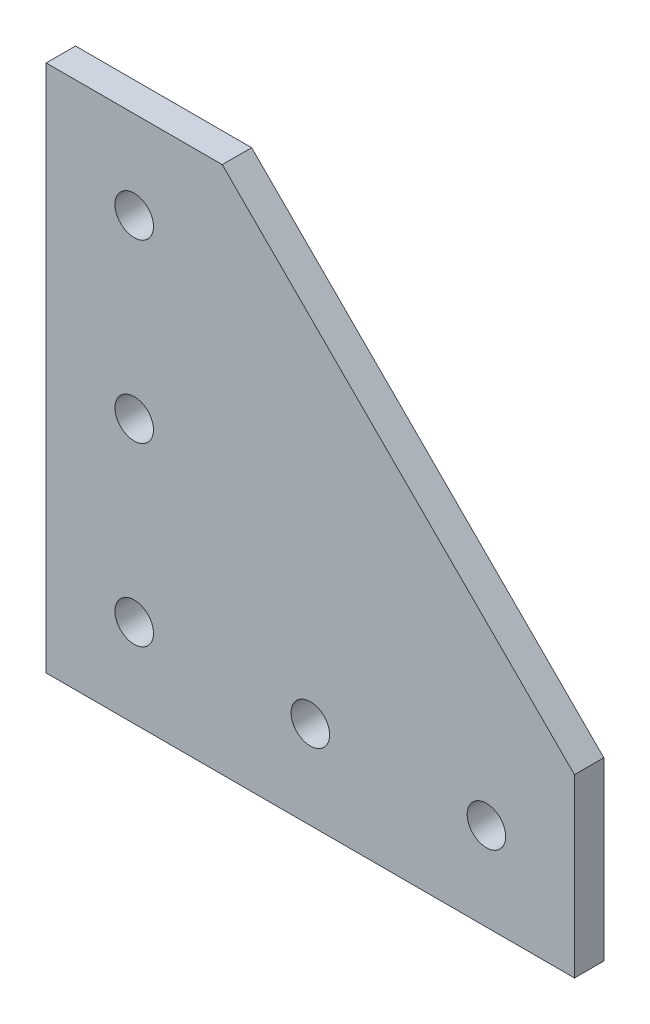
ISO-10303-21;
HEADER;
FILE_DESCRIPTION(('STEP AP214'),'2;1');
FILE_NAME('part.step','',(''),(''),'','','');
FILE_SCHEMA(('AUTOMOTIVE_DESIGN { 1 0 10303 214 1 1 1 1 }'));
ENDSEC;
DATA;
#1=APPLICATION_CONTEXT('core data for automotive mechanical design processes');
#2=APPLICATION_PROTOCOL_DEFINITION('international standard','automotive_design',2000,#1);
#3=PRODUCT_CONTEXT('',#1,'mechanical');
#4=PRODUCT('Part','Part','',(#3));
#5=PRODUCT_RELATED_PRODUCT_CATEGORY('part','',(#4));
#6=PRODUCT_DEFINITION_FORMATION('','',#4);
#7=PRODUCT_DEFINITION_CONTEXT('part definition',#1,'design');
#8=PRODUCT_DEFINITION('design','',#6,#7);
#9=PRODUCT_DEFINITION_SHAPE('','',#8);
#10=(LENGTH_UNIT() NAMED_UNIT(*) SI_UNIT(.MILLI.,.METRE.));
#11=(NAMED_UNIT(*) PLANE_ANGLE_UNIT() SI_UNIT($,.RADIAN.));
#12=(NAMED_UNIT(*) SI_UNIT($,.STERADIAN.) SOLID_ANGLE_UNIT());
#13=UNCERTAINTY_MEASURE_WITH_UNIT(LENGTH_MEASURE(1.E-05),#10,'distance_accuracy_value','');
#14=(GEOMETRIC_REPRESENTATION_CONTEXT(3) GLOBAL_UNCERTAINTY_ASSIGNED_CONTEXT((#13)) GLOBAL_UNIT_ASSIGNED_CONTEXT((#10,
#11,#12)) REPRESENTATION_CONTEXT('',''));
#15=CARTESIAN_POINT('',(0.,0.,0.));
#16=DIRECTION('',(0.,0.,1.));
#17=DIRECTION('',(1.,0.,0.));
#18=AXIS2_PLACEMENT_3D('',#15,#16,#17);
#19=CARTESIAN_POINT('',(0.,0.,3.175));
#20=DIRECTION('',(0.,0.,-1.));
#21=DIRECTION('',(-1.,0.,0.));
#22=AXIS2_PLACEMENT_3D('',#19,#20,#21);
#23=PLANE('',#22);
#24=CARTESIAN_POINT('',(19.05,95.25,3.175));
#25=DIRECTION('',(0.,0.,1.));
#26=DIRECTION('',(1.,0.,0.));
#27=AXIS2_PLACEMENT_3D('',#24,#25,#26);
#28=CIRCLE('',#27,4.1656);
#29=CARTESIAN_POINT('',(23.2156,95.25,3.175));
#30=VERTEX_POINT('',#29);
#31=EDGE_CURVE('E178',#30,#30,#28,.T.);
#32=ORIENTED_EDGE('',*,*,#31,.F.);
#33=EDGE_LOOP('',(#32));
#34=FACE_BOUND('',#33,.T.);
#35=CARTESIAN_POINT('',(57.15,19.05,3.175));
#36=DIRECTION('',(0.,0.,1.));
#37=DIRECTION('',(1.,0.,0.));
#38=AXIS2_PLACEMENT_3D('',#35,#36,#37);
#39=CIRCLE('',#38,4.1656);
#40=CARTESIAN_POINT('',(61.3156,19.05,3.175));
#41=VERTEX_POINT('',#40);
#42=EDGE_CURVE('E190',#41,#41,#39,.T.);
#43=ORIENTED_EDGE('',*,*,#42,.F.);
#44=EDGE_LOOP('',(#43));
#45=FACE_BOUND('',#44,.T.);
#46=DIRECTION('',(1.,0.,0.));
#47=VECTOR('',#46,1.);
#48=CARTESIAN_POINT('',(114.3,0.,3.175));
#49=LINE('',#48,#47);
#50=CARTESIAN_POINT('',(0.,0.,3.175));
#51=VERTEX_POINT('',#50);
#52=CARTESIAN_POINT('',(114.3,0.,3.175));
#53=VERTEX_POINT('',#52);
#54=EDGE_CURVE('E118',#51,#53,#49,.T.);
#55=ORIENTED_EDGE('',*,*,#54,.T.);
#56=DIRECTION('',(0.,1.,0.));
#57=VECTOR('',#56,1.);
#58=CARTESIAN_POINT('',(114.3,38.1,3.175));
#59=LINE('',#58,#57);
#60=CARTESIAN_POINT('',(114.3,38.1,3.175));
#61=VERTEX_POINT('',#60);
#62=EDGE_CURVE('E85',#53,#61,#59,.T.);
#63=ORIENTED_EDGE('',*,*,#62,.T.);
#64=DIRECTION('',(-0.707106781186548,0.707106781186548,0.));
#65=VECTOR('',#64,1.);
#66=CARTESIAN_POINT('',(114.3,38.1,3.175));
#67=LINE('',#66,#65);
#68=CARTESIAN_POINT('',(38.1,114.3,3.175));
#69=VERTEX_POINT('',#68);
#70=EDGE_CURVE('E89',#61,#69,#67,.T.);
#71=ORIENTED_EDGE('',*,*,#70,.T.);
#72=DIRECTION('',(-1.,0.,0.));
#73=VECTOR('',#72,1.);
#74=CARTESIAN_POINT('',(0.,114.3,3.175));
#75=LINE('',#74,#73);
#76=CARTESIAN_POINT('',(0.,114.3,3.175));
#77=VERTEX_POINT('',#76);
#78=EDGE_CURVE('E93',#69,#77,#75,.T.);
#79=ORIENTED_EDGE('',*,*,#78,.T.);
#80=DIRECTION('',(0.,-1.,0.));
#81=VECTOR('',#80,1.);
#82=CARTESIAN_POINT('',(0.,0.,3.175));
#83=LINE('',#82,#81);
#84=EDGE_CURVE('E51',#77,#51,#83,.T.);
#85=ORIENTED_EDGE('',*,*,#84,.T.);
#86=EDGE_LOOP('',(#55,#63,#71,#79,#85));
#87=FACE_BOUND('',#86,.T.);
#88=CARTESIAN_POINT('',(19.05,19.05,3.175));
#89=DIRECTION('',(0.,0.,1.));
#90=DIRECTION('',(1.,0.,0.));
#91=AXIS2_PLACEMENT_3D('',#88,#89,#90);
#92=CIRCLE('',#91,4.1656);
#93=CARTESIAN_POINT('',(23.2156,19.05,3.175));
#94=VERTEX_POINT('',#93);
#95=EDGE_CURVE('E113',#94,#94,#92,.T.);
#96=ORIENTED_EDGE('',*,*,#95,.F.);
#97=EDGE_LOOP('',(#96));
#98=FACE_BOUND('',#97,.T.);
#99=CARTESIAN_POINT('',(95.25,19.05,3.175));
#100=DIRECTION('',(0.,0.,1.));
#101=DIRECTION('',(1.,0.,0.));
#102=AXIS2_PLACEMENT_3D('',#99,#100,#101);
#103=CIRCLE('',#102,4.1656);
#104=CARTESIAN_POINT('',(99.4156,19.05,3.175));
#105=VERTEX_POINT('',#104);
#106=EDGE_CURVE('E184',#105,#105,#103,.T.);
#107=ORIENTED_EDGE('',*,*,#106,.F.);
#108=EDGE_LOOP('',(#107));
#109=FACE_BOUND('',#108,.T.);
#110=CARTESIAN_POINT('',(19.05,57.15,3.175));
#111=DIRECTION('',(0.,0.,1.));
#112=DIRECTION('',(1.,0.,0.));
#113=AXIS2_PLACEMENT_3D('',#110,#111,#112);
#114=CIRCLE('',#113,4.1656);
#115=CARTESIAN_POINT('',(23.2156,57.15,3.175));
#116=VERTEX_POINT('',#115);
#117=EDGE_CURVE('E169',#116,#116,#114,.T.);
#118=ORIENTED_EDGE('',*,*,#117,.F.);
#119=EDGE_LOOP('',(#118));
#120=FACE_BOUND('',#119,.T.);
#121=ADVANCED_FACE('F34',(#34,#45,#87,#98,#109,#120),#23,.F.);
#122=CARTESIAN_POINT('',(0.,0.,-3.175));
#123=DIRECTION('',(0.,0.,-1.));
#124=DIRECTION('',(-1.,0.,0.));
#125=AXIS2_PLACEMENT_3D('',#122,#123,#124);
#126=PLANE('',#125);
#127=CARTESIAN_POINT('',(19.05,95.25,-3.175));
#128=DIRECTION('',(0.,0.,1.));
#129=DIRECTION('',(1.,0.,0.));
#130=AXIS2_PLACEMENT_3D('',#127,#128,#129);
#131=CIRCLE('',#130,4.1656);
#132=CARTESIAN_POINT('',(23.2156,95.25,-3.175));
#133=VERTEX_POINT('',#132);
#134=EDGE_CURVE('E175',#133,#133,#131,.T.);
#135=ORIENTED_EDGE('',*,*,#134,.T.);
#136=EDGE_LOOP('',(#135));
#137=FACE_BOUND('',#136,.T.);
#138=CARTESIAN_POINT('',(57.15,19.05,-3.175));
#139=DIRECTION('',(0.,0.,1.));
#140=DIRECTION('',(1.,0.,0.));
#141=AXIS2_PLACEMENT_3D('',#138,#139,#140);
#142=CIRCLE('',#141,4.1656);
#143=CARTESIAN_POINT('',(61.3156,19.05,-3.175));
#144=VERTEX_POINT('',#143);
#145=EDGE_CURVE('E187',#144,#144,#142,.T.);
#146=ORIENTED_EDGE('',*,*,#145,.T.);
#147=EDGE_LOOP('',(#146));
#148=FACE_BOUND('',#147,.T.);
#149=DIRECTION('',(1.,0.,0.));
#150=VECTOR('',#149,1.);
#151=CARTESIAN_POINT('',(114.3,0.,-3.175));
#152=LINE('',#151,#150);
#153=CARTESIAN_POINT('',(0.,0.,-3.175));
#154=VERTEX_POINT('',#153);
#155=CARTESIAN_POINT('',(114.3,0.,-3.175));
#156=VERTEX_POINT('',#155);
#157=EDGE_CURVE('E109',#154,#156,#152,.T.);
#158=ORIENTED_EDGE('',*,*,#157,.F.);
#159=DIRECTION('',(0.,-1.,0.));
#160=VECTOR('',#159,1.);
#161=CARTESIAN_POINT('',(0.,0.,-3.175));
#162=LINE('',#161,#160);
#163=CARTESIAN_POINT('',(0.,114.3,-3.175));
#164=VERTEX_POINT('',#163);
#165=EDGE_CURVE('E77',#164,#154,#162,.T.);
#166=ORIENTED_EDGE('',*,*,#165,.F.);
#167=DIRECTION('',(-1.,0.,0.));
#168=VECTOR('',#167,1.);
#169=CARTESIAN_POINT('',(0.,114.3,-3.175));
#170=LINE('',#169,#168);
#171=CARTESIAN_POINT('',(38.1,114.3,-3.175));
#172=VERTEX_POINT('',#171);
#173=EDGE_CURVE('E71',#172,#164,#170,.T.);
#174=ORIENTED_EDGE('',*,*,#173,.F.);
#175=DIRECTION('',(-0.707106781186548,0.707106781186548,0.));
#176=VECTOR('',#175,1.);
#177=CARTESIAN_POINT('',(114.3,38.1,-3.175));
#178=LINE('',#177,#176);
#179=CARTESIAN_POINT('',(114.3,38.1,-3.175));
#180=VERTEX_POINT('',#179);
#181=EDGE_CURVE('E100',#180,#172,#178,.T.);
#182=ORIENTED_EDGE('',*,*,#181,.F.);
#183=DIRECTION('',(0.,1.,0.));
#184=VECTOR('',#183,1.);
#185=CARTESIAN_POINT('',(114.3,38.1,-3.175));
#186=LINE('',#185,#184);
#187=EDGE_CURVE('E112',#156,#180,#186,.T.);
#188=ORIENTED_EDGE('',*,*,#187,.F.);
#189=EDGE_LOOP('',(#158,#166,#174,#182,#188));
#190=FACE_BOUND('',#189,.T.);
#191=CARTESIAN_POINT('',(19.05,19.05,-3.175));
#192=DIRECTION('',(0.,0.,1.));
#193=DIRECTION('',(1.,0.,0.));
#194=AXIS2_PLACEMENT_3D('',#191,#192,#193);
#195=CIRCLE('',#194,4.1656);
#196=CARTESIAN_POINT('',(23.2156,19.05,-3.175));
#197=VERTEX_POINT('',#196);
#198=EDGE_CURVE('E193',#197,#197,#195,.T.);
#199=ORIENTED_EDGE('',*,*,#198,.T.);
#200=EDGE_LOOP('',(#199));
#201=FACE_BOUND('',#200,.T.);
#202=CARTESIAN_POINT('',(95.25,19.05,-3.175));
#203=DIRECTION('',(0.,0.,1.));
#204=DIRECTION('',(1.,0.,0.));
#205=AXIS2_PLACEMENT_3D('',#202,#203,#204);
#206=CIRCLE('',#205,4.1656);
#207=CARTESIAN_POINT('',(99.4156,19.05,-3.175));
#208=VERTEX_POINT('',#207);
#209=EDGE_CURVE('E181',#208,#208,#206,.T.);
#210=ORIENTED_EDGE('',*,*,#209,.T.);
#211=EDGE_LOOP('',(#210));
#212=FACE_BOUND('',#211,.T.);
#213=CARTESIAN_POINT('',(19.05,57.15,-3.175));
#214=DIRECTION('',(0.,0.,1.));
#215=DIRECTION('',(1.,0.,0.));
#216=AXIS2_PLACEMENT_3D('',#213,#214,#215);
#217=CIRCLE('',#216,4.1656);
#218=CARTESIAN_POINT('',(23.2156,57.15,-3.175));
#219=VERTEX_POINT('',#218);
#220=EDGE_CURVE('E172',#219,#219,#217,.T.);
#221=ORIENTED_EDGE('',*,*,#220,.T.);
#222=EDGE_LOOP('',(#221));
#223=FACE_BOUND('',#222,.T.);
#224=ADVANCED_FACE('F122',(#137,#148,#190,#201,#212,#223),#126,.T.);
#225=CARTESIAN_POINT('',(114.3,0.,3.175));
#226=DIRECTION('',(0.,1.,0.));
#227=DIRECTION('',(-1.,0.,0.));
#228=AXIS2_PLACEMENT_3D('',#225,#226,#227);
#229=PLANE('',#228);
#230=ORIENTED_EDGE('',*,*,#157,.T.);
#231=DIRECTION('',(0.,0.,-1.));
#232=VECTOR('',#231,1.);
#233=CARTESIAN_POINT('',(114.3,0.,3.175));
#234=LINE('',#233,#232);
#235=EDGE_CURVE('E11',#53,#156,#234,.T.);
#236=ORIENTED_EDGE('',*,*,#235,.F.);
#237=ORIENTED_EDGE('',*,*,#54,.F.);
#238=DIRECTION('',(0.,0.,-1.));
#239=VECTOR('',#238,1.);
#240=CARTESIAN_POINT('',(0.,0.,3.175));
#241=LINE('',#240,#239);
#242=EDGE_CURVE('E105',#51,#154,#241,.T.);
#243=ORIENTED_EDGE('',*,*,#242,.T.);
#244=EDGE_LOOP('',(#230,#236,#237,#243));
#245=FACE_BOUND('',#244,.T.);
#246=ADVANCED_FACE('F36',(#245),#229,.F.);
#247=CARTESIAN_POINT('',(114.3,38.1,3.175));
#248=DIRECTION('',(-1.,0.,0.));
#249=DIRECTION('',(0.,0.,1.));
#250=AXIS2_PLACEMENT_3D('',#247,#248,#249);
#251=PLANE('',#250);
#252=ORIENTED_EDGE('',*,*,#187,.T.);
#253=DIRECTION('',(0.,0.,-1.));
#254=VECTOR('',#253,1.);
#255=CARTESIAN_POINT('',(114.3,38.1,3.175));
#256=LINE('',#255,#254);
#257=EDGE_CURVE('E43',#61,#180,#256,.T.);
#258=ORIENTED_EDGE('',*,*,#257,.F.);
#259=ORIENTED_EDGE('',*,*,#62,.F.);
#260=ORIENTED_EDGE('',*,*,#235,.T.);
#261=EDGE_LOOP('',(#252,#258,#259,#260));
#262=FACE_BOUND('',#261,.T.);
#263=ADVANCED_FACE('F242',(#262),#251,.F.);
#264=CARTESIAN_POINT('',(114.3,38.1,3.175));
#265=DIRECTION('',(-0.707106781186548,-0.707106781186548,0.));
#266=DIRECTION('',(0.707106781186548,-0.707106781186548,0.));
#267=AXIS2_PLACEMENT_3D('',#264,#265,#266);
#268=PLANE('',#267);
#269=ORIENTED_EDGE('',*,*,#181,.T.);
#270=DIRECTION('',(0.,0.,-1.));
#271=VECTOR('',#270,1.);
#272=CARTESIAN_POINT('',(38.1,114.3,3.175));
#273=LINE('',#272,#271);
#274=EDGE_CURVE('E97',#69,#172,#273,.T.);
#275=ORIENTED_EDGE('',*,*,#274,.F.);
#276=ORIENTED_EDGE('',*,*,#70,.F.);
#277=ORIENTED_EDGE('',*,*,#257,.T.);
#278=EDGE_LOOP('',(#269,#275,#276,#277));
#279=FACE_BOUND('',#278,.T.);
#280=ADVANCED_FACE('F98',(#279),#268,.F.);
#281=CARTESIAN_POINT('',(0.,114.3,3.175));
#282=DIRECTION('',(0.,-1.,0.));
#283=DIRECTION('',(0.,0.,-1.));
#284=AXIS2_PLACEMENT_3D('',#281,#282,#283);
#285=PLANE('',#284);
#286=ORIENTED_EDGE('',*,*,#173,.T.);
#287=DIRECTION('',(0.,0.,-1.));
#288=VECTOR('',#287,1.);
#289=CARTESIAN_POINT('',(0.,114.3,3.175));
#290=LINE('',#289,#288);
#291=EDGE_CURVE('E101',#77,#164,#290,.T.);
#292=ORIENTED_EDGE('',*,*,#291,.F.);
#293=ORIENTED_EDGE('',*,*,#78,.F.);
#294=ORIENTED_EDGE('',*,*,#274,.T.);
#295=EDGE_LOOP('',(#286,#292,#293,#294));
#296=FACE_BOUND('',#295,.T.);
#297=ADVANCED_FACE('F103',(#296),#285,.F.);
#298=CARTESIAN_POINT('',(0.,0.,3.175));
#299=DIRECTION('',(1.,0.,0.));
#300=DIRECTION('',(0.,0.,-1.));
#301=AXIS2_PLACEMENT_3D('',#298,#299,#300);
#302=PLANE('',#301);
#303=ORIENTED_EDGE('',*,*,#165,.T.);
#304=ORIENTED_EDGE('',*,*,#242,.F.);
#305=ORIENTED_EDGE('',*,*,#84,.F.);
#306=ORIENTED_EDGE('',*,*,#291,.T.);
#307=EDGE_LOOP('',(#303,#304,#305,#306));
#308=FACE_BOUND('',#307,.T.);
#309=ADVANCED_FACE('F127',(#308),#302,.F.);
#310=CARTESIAN_POINT('',(19.05,19.05,3.175));
#311=DIRECTION('',(0.,0.,-1.));
#312=DIRECTION('',(-1.,0.,0.));
#313=AXIS2_PLACEMENT_3D('',#310,#311,#312);
#314=CYLINDRICAL_SURFACE('',#313,4.1656);
#315=ORIENTED_EDGE('',*,*,#95,.T.);
#316=EDGE_LOOP('',(#315));
#317=FACE_BOUND('',#316,.T.);
#318=ORIENTED_EDGE('',*,*,#198,.F.);
#319=EDGE_LOOP('',(#318));
#320=FACE_BOUND('',#319,.T.);
#321=ADVANCED_FACE('F129',(#317,#320),#314,.F.);
#322=CARTESIAN_POINT('',(57.15,19.05,3.175));
#323=DIRECTION('',(0.,0.,-1.));
#324=DIRECTION('',(-1.,0.,0.));
#325=AXIS2_PLACEMENT_3D('',#322,#323,#324);
#326=CYLINDRICAL_SURFACE('',#325,4.1656);
#327=ORIENTED_EDGE('',*,*,#42,.T.);
#328=EDGE_LOOP('',(#327));
#329=FACE_BOUND('',#328,.T.);
#330=ORIENTED_EDGE('',*,*,#145,.F.);
#331=EDGE_LOOP('',(#330));
#332=FACE_BOUND('',#331,.T.);
#333=ADVANCED_FACE('F135',(#329,#332),#326,.F.);
#334=CARTESIAN_POINT('',(95.25,19.05,3.175));
#335=DIRECTION('',(0.,0.,-1.));
#336=DIRECTION('',(-1.,0.,0.));
#337=AXIS2_PLACEMENT_3D('',#334,#335,#336);
#338=CYLINDRICAL_SURFACE('',#337,4.1656);
#339=ORIENTED_EDGE('',*,*,#106,.T.);
#340=EDGE_LOOP('',(#339));
#341=FACE_BOUND('',#340,.T.);
#342=ORIENTED_EDGE('',*,*,#209,.F.);
#343=EDGE_LOOP('',(#342));
#344=FACE_BOUND('',#343,.T.);
#345=ADVANCED_FACE('F152',(#341,#344),#338,.F.);
#346=CARTESIAN_POINT('',(19.05,95.25,3.175));
#347=DIRECTION('',(0.,0.,-1.));
#348=DIRECTION('',(-1.,0.,0.));
#349=AXIS2_PLACEMENT_3D('',#346,#347,#348);
#350=CYLINDRICAL_SURFACE('',#349,4.1656);
#351=ORIENTED_EDGE('',*,*,#31,.T.);
#352=EDGE_LOOP('',(#351));
#353=FACE_BOUND('',#352,.T.);
#354=ORIENTED_EDGE('',*,*,#134,.F.);
#355=EDGE_LOOP('',(#354));
#356=FACE_BOUND('',#355,.T.);
#357=ADVANCED_FACE('F156',(#353,#356),#350,.F.);
#358=CARTESIAN_POINT('',(19.05,57.15,3.175));
#359=DIRECTION('',(0.,0.,-1.));
#360=DIRECTION('',(-1.,0.,0.));
#361=AXIS2_PLACEMENT_3D('',#358,#359,#360);
#362=CYLINDRICAL_SURFACE('',#361,4.1656);
#363=ORIENTED_EDGE('',*,*,#117,.T.);
#364=EDGE_LOOP('',(#363));
#365=FACE_BOUND('',#364,.T.);
#366=ORIENTED_EDGE('',*,*,#220,.F.);
#367=EDGE_LOOP('',(#366));
#368=FACE_BOUND('',#367,.T.);
#369=ADVANCED_FACE('F160',(#365,#368),#362,.F.);
#370=CLOSED_SHELL('',(#121,#224,#246,#263,#280,#297,#309,#321,#333,#345,#357,#369));
#371=MANIFOLD_SOLID_BREP('B2',#370);
#372=ADVANCED_BREP_SHAPE_REPRESENTATION('',(#18,#371),#14);
#373=SHAPE_DEFINITION_REPRESENTATION(#9,#372);
ENDSEC;
END-ISO-10303-21;
